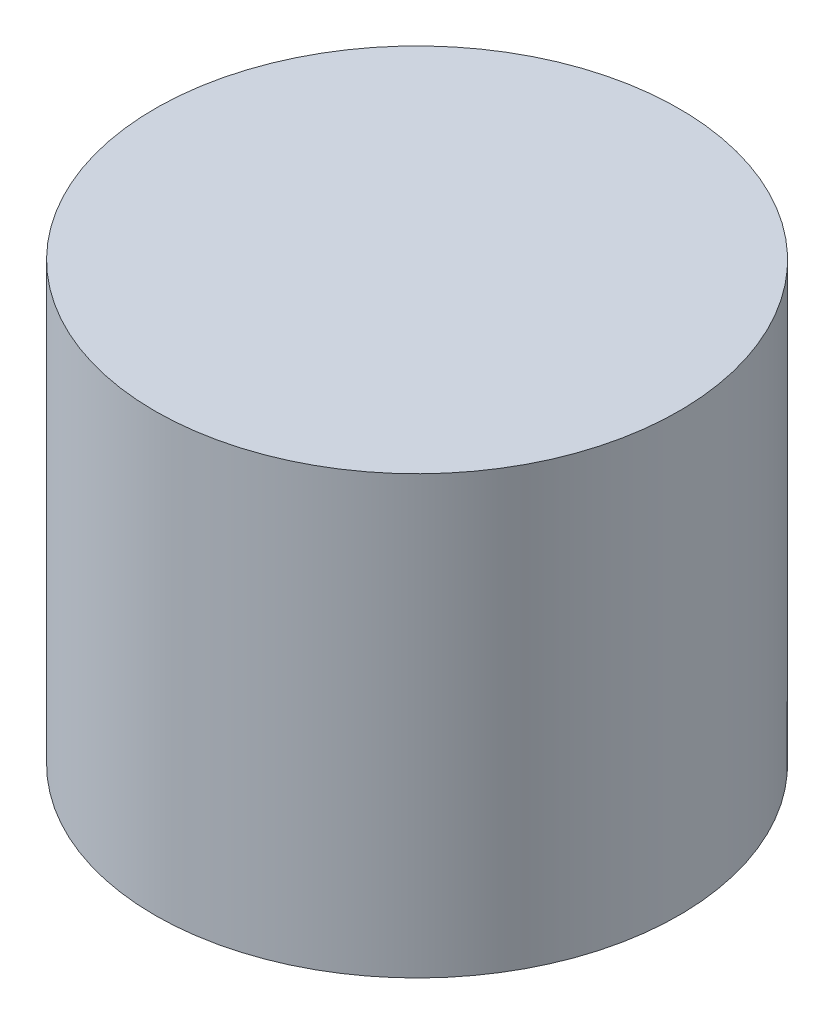
ISO-10303-21;
HEADER;
FILE_DESCRIPTION(('STEP AP214'),'2;1');
FILE_NAME('part.step','',(''),(''),'','','');
FILE_SCHEMA(('AUTOMOTIVE_DESIGN { 1 0 10303 214 1 1 1 1 }'));
ENDSEC;
DATA;
#1=APPLICATION_CONTEXT('core data for automotive mechanical design processes');
#2=APPLICATION_PROTOCOL_DEFINITION('international standard','automotive_design',2000,#1);
#3=PRODUCT_CONTEXT('',#1,'mechanical');
#4=PRODUCT('Part','Part','',(#3));
#5=PRODUCT_RELATED_PRODUCT_CATEGORY('part','',(#4));
#6=PRODUCT_DEFINITION_FORMATION('','',#4);
#7=PRODUCT_DEFINITION_CONTEXT('part definition',#1,'design');
#8=PRODUCT_DEFINITION('design','',#6,#7);
#9=PRODUCT_DEFINITION_SHAPE('','',#8);
#10=(LENGTH_UNIT() NAMED_UNIT(*) SI_UNIT(.MILLI.,.METRE.));
#11=(NAMED_UNIT(*) PLANE_ANGLE_UNIT() SI_UNIT($,.RADIAN.));
#12=(NAMED_UNIT(*) SI_UNIT($,.STERADIAN.) SOLID_ANGLE_UNIT());
#13=UNCERTAINTY_MEASURE_WITH_UNIT(LENGTH_MEASURE(1.E-05),#10,'distance_accuracy_value','');
#14=(GEOMETRIC_REPRESENTATION_CONTEXT(3) GLOBAL_UNCERTAINTY_ASSIGNED_CONTEXT((#13)) GLOBAL_UNIT_ASSIGNED_CONTEXT((#10,
#11,#12)) REPRESENTATION_CONTEXT('',''));
#15=CARTESIAN_POINT('',(0.,0.,0.));
#16=DIRECTION('',(0.,0.,1.));
#17=DIRECTION('',(1.,0.,0.));
#18=AXIS2_PLACEMENT_3D('',#15,#16,#17);
#19=CARTESIAN_POINT('',(0.,25.,0.));
#20=DIRECTION('',(0.,-1.,0.));
#21=DIRECTION('',(0.,0.,-1.));
#22=AXIS2_PLACEMENT_3D('',#19,#20,#21);
#23=CYLINDRICAL_SURFACE('',#22,15.);
#24=CARTESIAN_POINT('',(0.,25.,0.));
#25=DIRECTION('',(0.,1.,0.));
#26=DIRECTION('',(0.,0.,1.));
#27=AXIS2_PLACEMENT_3D('',#24,#25,#26);
#28=CIRCLE('',#27,15.);
#29=CARTESIAN_POINT('',(0.,25.,15.));
#30=VERTEX_POINT('',#29);
#31=EDGE_CURVE('E10',#30,#30,#28,.T.);
#32=ORIENTED_EDGE('',*,*,#31,.F.);
#33=EDGE_LOOP('',(#32));
#34=FACE_BOUND('',#33,.T.);
#35=CARTESIAN_POINT('',(0.,0.,0.));
#36=DIRECTION('',(0.,1.,0.));
#37=DIRECTION('',(0.,0.,1.));
#38=AXIS2_PLACEMENT_3D('',#35,#36,#37);
#39=CIRCLE('',#38,15.);
#40=CARTESIAN_POINT('',(0.,0.,15.));
#41=VERTEX_POINT('',#40);
#42=EDGE_CURVE('E34',#41,#41,#39,.T.);
#43=ORIENTED_EDGE('',*,*,#42,.T.);
#44=EDGE_LOOP('',(#43));
#45=FACE_BOUND('',#44,.T.);
#46=ADVANCED_FACE('F31',(#34,#45),#23,.T.);
#47=CARTESIAN_POINT('',(0.,25.,0.));
#48=DIRECTION('',(0.,1.,0.));
#49=DIRECTION('',(0.,0.,1.));
#50=AXIS2_PLACEMENT_3D('',#47,#48,#49);
#51=PLANE('',#50);
#52=ORIENTED_EDGE('',*,*,#31,.T.);
#53=EDGE_LOOP('',(#52));
#54=FACE_BOUND('',#53,.T.);
#55=ADVANCED_FACE('F46',(#54),#51,.T.);
#56=CARTESIAN_POINT('',(0.,0.,0.));
#57=DIRECTION('',(0.,1.,0.));
#58=DIRECTION('',(0.,0.,1.));
#59=AXIS2_PLACEMENT_3D('',#56,#57,#58);
#60=PLANE('',#59);
#61=ORIENTED_EDGE('',*,*,#42,.F.);
#62=EDGE_LOOP('',(#61));
#63=FACE_BOUND('',#62,.T.);
#64=ADVANCED_FACE('F44',(#63),#60,.F.);
#65=CLOSED_SHELL('',(#46,#55,#64));
#66=MANIFOLD_SOLID_BREP('B2',#65);
#67=ADVANCED_BREP_SHAPE_REPRESENTATION('',(#18,#66),#14);
#68=SHAPE_DEFINITION_REPRESENTATION(#9,#67);
ENDSEC;
END-ISO-10303-21;
